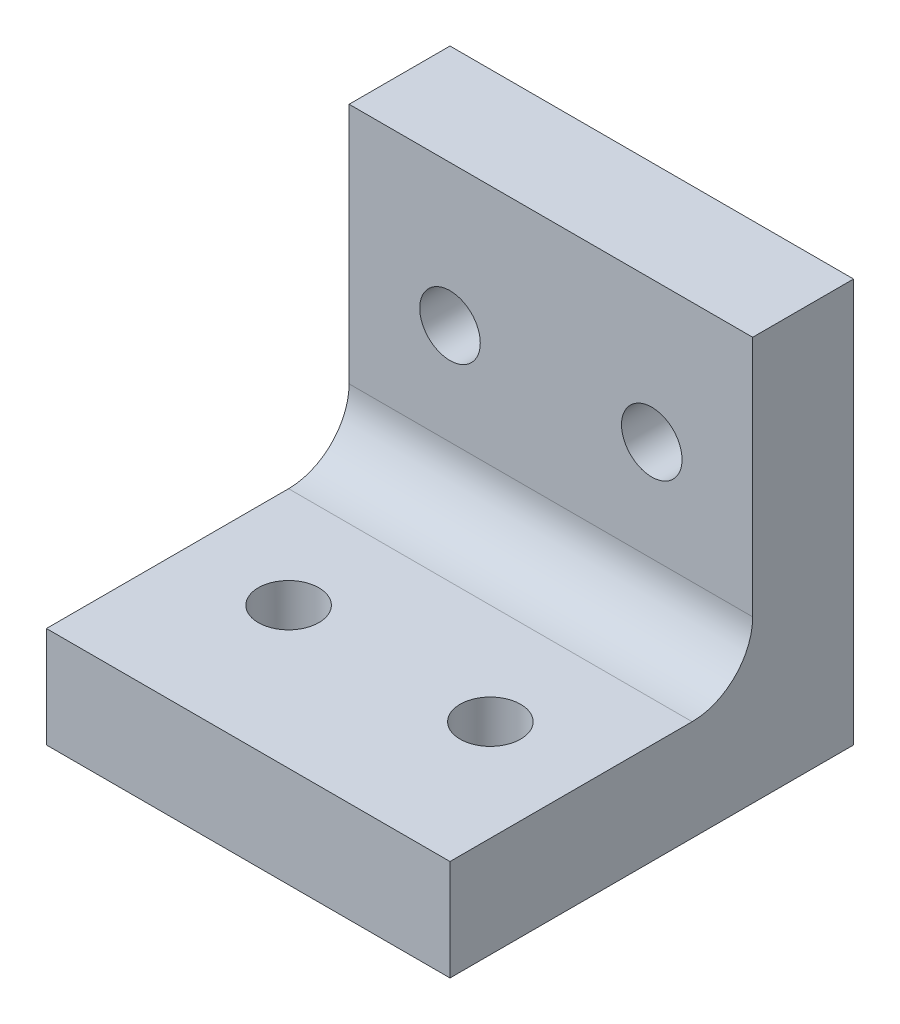
ISO-10303-21;
HEADER;
FILE_DESCRIPTION(('STEP AP214'),'2;1');
FILE_NAME('part.step','',(''),(''),'','','');
FILE_SCHEMA(('AUTOMOTIVE_DESIGN { 1 0 10303 214 1 1 1 1 }'));
ENDSEC;
DATA;
#1=APPLICATION_CONTEXT('core data for automotive mechanical design processes');
#2=APPLICATION_PROTOCOL_DEFINITION('international standard','automotive_design',2000,#1);
#3=PRODUCT_CONTEXT('',#1,'mechanical');
#4=PRODUCT('Part','Part','',(#3));
#5=PRODUCT_RELATED_PRODUCT_CATEGORY('part','',(#4));
#6=PRODUCT_DEFINITION_FORMATION('','',#4);
#7=PRODUCT_DEFINITION_CONTEXT('part definition',#1,'design');
#8=PRODUCT_DEFINITION('design','',#6,#7);
#9=PRODUCT_DEFINITION_SHAPE('','',#8);
#10=(LENGTH_UNIT() NAMED_UNIT(*) SI_UNIT(.MILLI.,.METRE.));
#11=(NAMED_UNIT(*) PLANE_ANGLE_UNIT() SI_UNIT($,.RADIAN.));
#12=(NAMED_UNIT(*) SI_UNIT($,.STERADIAN.) SOLID_ANGLE_UNIT());
#13=UNCERTAINTY_MEASURE_WITH_UNIT(LENGTH_MEASURE(1.E-05),#10,'distance_accuracy_value','');
#14=(GEOMETRIC_REPRESENTATION_CONTEXT(3) GLOBAL_UNCERTAINTY_ASSIGNED_CONTEXT((#13)) GLOBAL_UNIT_ASSIGNED_CONTEXT((#10,
#11,#12)) REPRESENTATION_CONTEXT('',''));
#15=CARTESIAN_POINT('',(0.,0.,0.));
#16=DIRECTION('',(0.,0.,1.));
#17=DIRECTION('',(1.,0.,0.));
#18=AXIS2_PLACEMENT_3D('',#15,#16,#17);
#19=CARTESIAN_POINT('',(0.,5.,0.));
#20=DIRECTION('',(0.,-1.,0.));
#21=DIRECTION('',(0.,0.,-1.));
#22=AXIS2_PLACEMENT_3D('',#19,#20,#21);
#23=PLANE('',#22);
#24=DIRECTION('',(0.,0.,-1.));
#25=VECTOR('',#24,1.);
#26=CARTESIAN_POINT('',(10.,5.,10.));
#27=LINE('',#26,#25);
#28=CARTESIAN_POINT('',(10.,5.,10.));
#29=VERTEX_POINT('',#28);
#30=CARTESIAN_POINT('',(10.,5.,-2.));
#31=VERTEX_POINT('',#30);
#32=EDGE_CURVE('E129',#29,#31,#27,.T.);
#33=ORIENTED_EDGE('',*,*,#32,.T.);
#34=DIRECTION('',(1.,0.,0.));
#35=VECTOR('',#34,1.);
#36=CARTESIAN_POINT('',(-10.,5.,-2.));
#37=LINE('',#36,#35);
#38=CARTESIAN_POINT('',(-10.,5.,-2.));
#39=VERTEX_POINT('',#38);
#40=EDGE_CURVE('E59',#31,#39,#37,.F.);
#41=ORIENTED_EDGE('',*,*,#40,.T.);
#42=DIRECTION('',(0.,0.,1.));
#43=VECTOR('',#42,1.);
#44=CARTESIAN_POINT('',(-10.,5.,10.));
#45=LINE('',#44,#43);
#46=CARTESIAN_POINT('',(-10.,5.,10.));
#47=VERTEX_POINT('',#46);
#48=EDGE_CURVE('E131',#39,#47,#45,.T.);
#49=ORIENTED_EDGE('',*,*,#48,.T.);
#50=DIRECTION('',(1.,0.,0.));
#51=VECTOR('',#50,1.);
#52=CARTESIAN_POINT('',(-10.,5.,10.));
#53=LINE('',#52,#51);
#54=EDGE_CURVE('E134',#47,#29,#53,.T.);
#55=ORIENTED_EDGE('',*,*,#54,.T.);
#56=EDGE_LOOP('',(#33,#41,#49,#55));
#57=FACE_BOUND('',#56,.T.);
#58=CARTESIAN_POINT('',(5.,5.,3.));
#59=DIRECTION('',(0.,-1.,0.));
#60=DIRECTION('',(0.,0.,-1.));
#61=AXIS2_PLACEMENT_3D('',#58,#59,#60);
#62=CIRCLE('',#61,1.5);
#63=CARTESIAN_POINT('',(5.,5.,1.5));
#64=VERTEX_POINT('',#63);
#65=EDGE_CURVE('E307',#64,#64,#62,.F.);
#66=ORIENTED_EDGE('',*,*,#65,.F.);
#67=EDGE_LOOP('',(#66));
#68=FACE_BOUND('',#67,.T.);
#69=CARTESIAN_POINT('',(-5.,5.,3.));
#70=DIRECTION('',(0.,-1.,0.));
#71=DIRECTION('',(0.,0.,-1.));
#72=AXIS2_PLACEMENT_3D('',#69,#70,#71);
#73=CIRCLE('',#72,1.5);
#74=CARTESIAN_POINT('',(-5.,5.,1.5));
#75=VERTEX_POINT('',#74);
#76=EDGE_CURVE('E115',#75,#75,#73,.T.);
#77=ORIENTED_EDGE('',*,*,#76,.T.);
#78=EDGE_LOOP('',(#77));
#79=FACE_BOUND('',#78,.T.);
#80=ADVANCED_FACE('F38',(#57,#68,#79),#23,.F.);
#81=CARTESIAN_POINT('',(0.,0.,0.));
#82=DIRECTION('',(0.,-1.,0.));
#83=DIRECTION('',(0.,0.,-1.));
#84=AXIS2_PLACEMENT_3D('',#81,#82,#83);
#85=PLANE('',#84);
#86=CARTESIAN_POINT('',(5.,0.,3.));
#87=DIRECTION('',(0.,-1.,0.));
#88=DIRECTION('',(0.,0.,-1.));
#89=AXIS2_PLACEMENT_3D('',#86,#87,#88);
#90=CIRCLE('',#89,1.5);
#91=CARTESIAN_POINT('',(5.,0.,1.5));
#92=VERTEX_POINT('',#91);
#93=EDGE_CURVE('E308',#92,#92,#90,.T.);
#94=ORIENTED_EDGE('',*,*,#93,.F.);
#95=EDGE_LOOP('',(#94));
#96=FACE_BOUND('',#95,.T.);
#97=DIRECTION('',(0.,0.,-1.));
#98=VECTOR('',#97,1.);
#99=CARTESIAN_POINT('',(10.,0.,10.));
#100=LINE('',#99,#98);
#101=CARTESIAN_POINT('',(10.,0.,10.));
#102=VERTEX_POINT('',#101);
#103=CARTESIAN_POINT('',(10.,0.,-10.));
#104=VERTEX_POINT('',#103);
#105=EDGE_CURVE('E121',#102,#104,#100,.T.);
#106=ORIENTED_EDGE('',*,*,#105,.F.);
#107=DIRECTION('',(1.,0.,0.));
#108=VECTOR('',#107,1.);
#109=CARTESIAN_POINT('',(-10.,0.,10.));
#110=LINE('',#109,#108);
#111=CARTESIAN_POINT('',(-10.,0.,10.));
#112=VERTEX_POINT('',#111);
#113=EDGE_CURVE('E132',#112,#102,#110,.T.);
#114=ORIENTED_EDGE('',*,*,#113,.F.);
#115=DIRECTION('',(0.,0.,1.));
#116=VECTOR('',#115,1.);
#117=CARTESIAN_POINT('',(-10.,0.,10.));
#118=LINE('',#117,#116);
#119=CARTESIAN_POINT('',(-10.,0.,-10.));
#120=VERTEX_POINT('',#119);
#121=EDGE_CURVE('E138',#120,#112,#118,.T.);
#122=ORIENTED_EDGE('',*,*,#121,.F.);
#123=DIRECTION('',(-1.,0.,0.));
#124=VECTOR('',#123,1.);
#125=CARTESIAN_POINT('',(-10.,0.,-10.));
#126=LINE('',#125,#124);
#127=EDGE_CURVE('E124',#104,#120,#126,.T.);
#128=ORIENTED_EDGE('',*,*,#127,.F.);
#129=EDGE_LOOP('',(#106,#114,#122,#128));
#130=FACE_BOUND('',#129,.T.);
#131=CARTESIAN_POINT('',(-5.,0.,3.));
#132=DIRECTION('',(0.,1.,0.));
#133=DIRECTION('',(0.,0.,1.));
#134=AXIS2_PLACEMENT_3D('',#131,#132,#133);
#135=CIRCLE('',#134,1.5);
#136=CARTESIAN_POINT('',(-5.,0.,4.5));
#137=VERTEX_POINT('',#136);
#138=EDGE_CURVE('E304',#137,#137,#135,.T.);
#139=ORIENTED_EDGE('',*,*,#138,.T.);
#140=EDGE_LOOP('',(#139));
#141=FACE_BOUND('',#140,.T.);
#142=ADVANCED_FACE('F157',(#96,#130,#141),#85,.T.);
#143=CARTESIAN_POINT('',(10.,5.,10.));
#144=DIRECTION('',(-1.,0.,0.));
#145=DIRECTION('',(0.,0.,1.));
#146=AXIS2_PLACEMENT_3D('',#143,#144,#145);
#147=PLANE('',#146);
#148=ORIENTED_EDGE('',*,*,#105,.T.);
#149=DIRECTION('',(0.,-1.,0.));
#150=VECTOR('',#149,1.);
#151=CARTESIAN_POINT('',(10.,5.,-10.));
#152=LINE('',#151,#150);
#153=CARTESIAN_POINT('',(10.,20.,-10.));
#154=VERTEX_POINT('',#153);
#155=EDGE_CURVE('E101',#154,#104,#152,.T.);
#156=ORIENTED_EDGE('',*,*,#155,.F.);
#157=DIRECTION('',(0.,0.,-1.));
#158=VECTOR('',#157,1.);
#159=CARTESIAN_POINT('',(10.,20.,-10.));
#160=LINE('',#159,#158);
#161=CARTESIAN_POINT('',(10.,20.,-5.));
#162=VERTEX_POINT('',#161);
#163=EDGE_CURVE('E94',#162,#154,#160,.T.);
#164=ORIENTED_EDGE('',*,*,#163,.F.);
#165=DIRECTION('',(0.,-1.,0.));
#166=VECTOR('',#165,1.);
#167=CARTESIAN_POINT('',(10.,20.,-5.));
#168=LINE('',#167,#166);
#169=CARTESIAN_POINT('',(10.,8.,-5.));
#170=VERTEX_POINT('',#169);
#171=EDGE_CURVE('E99',#162,#170,#168,.T.);
#172=ORIENTED_EDGE('',*,*,#171,.T.);
#173=CARTESIAN_POINT('',(10.,8.,-2.));
#174=DIRECTION('',(-1.,0.,0.));
#175=DIRECTION('',(0.,0.,1.));
#176=AXIS2_PLACEMENT_3D('',#173,#174,#175);
#177=CIRCLE('',#176,3.);
#178=EDGE_CURVE('E46',#170,#31,#177,.T.);
#179=ORIENTED_EDGE('',*,*,#178,.T.);
#180=ORIENTED_EDGE('',*,*,#32,.F.);
#181=DIRECTION('',(0.,-1.,0.));
#182=VECTOR('',#181,1.);
#183=CARTESIAN_POINT('',(10.,5.,10.));
#184=LINE('',#183,#182);
#185=EDGE_CURVE('E135',#29,#102,#184,.T.);
#186=ORIENTED_EDGE('',*,*,#185,.T.);
#187=EDGE_LOOP('',(#148,#156,#164,#172,#179,#180,#186));
#188=FACE_BOUND('',#187,.T.);
#189=ADVANCED_FACE('F97',(#188),#147,.F.);
#190=CARTESIAN_POINT('',(-10.,5.,-10.));
#191=DIRECTION('',(0.,0.,1.));
#192=DIRECTION('',(1.,0.,0.));
#193=AXIS2_PLACEMENT_3D('',#190,#191,#192);
#194=PLANE('',#193);
#195=CARTESIAN_POINT('',(-5.,13.,-10.));
#196=DIRECTION('',(0.,0.,1.));
#197=DIRECTION('',(1.,0.,0.));
#198=AXIS2_PLACEMENT_3D('',#195,#196,#197);
#199=CIRCLE('',#198,1.5);
#200=CARTESIAN_POINT('',(-3.5,13.,-10.));
#201=VERTEX_POINT('',#200);
#202=EDGE_CURVE('E311',#201,#201,#199,.T.);
#203=ORIENTED_EDGE('',*,*,#202,.T.);
#204=EDGE_LOOP('',(#203));
#205=FACE_BOUND('',#204,.T.);
#206=CARTESIAN_POINT('',(5.,13.,-10.));
#207=DIRECTION('',(0.,0.,1.));
#208=DIRECTION('',(-1.,0.,0.));
#209=AXIS2_PLACEMENT_3D('',#206,#207,#208);
#210=CIRCLE('',#209,1.5);
#211=CARTESIAN_POINT('',(3.5,13.,-10.));
#212=VERTEX_POINT('',#211);
#213=EDGE_CURVE('E294',#212,#212,#210,.T.);
#214=ORIENTED_EDGE('',*,*,#213,.T.);
#215=EDGE_LOOP('',(#214));
#216=FACE_BOUND('',#215,.T.);
#217=ORIENTED_EDGE('',*,*,#127,.T.);
#218=DIRECTION('',(0.,-1.,0.));
#219=VECTOR('',#218,1.);
#220=CARTESIAN_POINT('',(-10.,5.,-10.));
#221=LINE('',#220,#219);
#222=CARTESIAN_POINT('',(-10.,20.,-10.));
#223=VERTEX_POINT('',#222);
#224=EDGE_CURVE('E146',#223,#120,#221,.T.);
#225=ORIENTED_EDGE('',*,*,#224,.F.);
#226=DIRECTION('',(-1.,0.,0.));
#227=VECTOR('',#226,1.);
#228=CARTESIAN_POINT('',(-10.,20.,-10.));
#229=LINE('',#228,#227);
#230=EDGE_CURVE('E105',#154,#223,#229,.T.);
#231=ORIENTED_EDGE('',*,*,#230,.F.);
#232=ORIENTED_EDGE('',*,*,#155,.T.);
#233=EDGE_LOOP('',(#217,#225,#231,#232));
#234=FACE_BOUND('',#233,.T.);
#235=ADVANCED_FACE('F152',(#205,#216,#234),#194,.F.);
#236=CARTESIAN_POINT('',(-10.,5.,10.));
#237=DIRECTION('',(1.,0.,0.));
#238=DIRECTION('',(0.,0.,-1.));
#239=AXIS2_PLACEMENT_3D('',#236,#237,#238);
#240=PLANE('',#239);
#241=ORIENTED_EDGE('',*,*,#121,.T.);
#242=DIRECTION('',(0.,-1.,0.));
#243=VECTOR('',#242,1.);
#244=CARTESIAN_POINT('',(-10.,5.,10.));
#245=LINE('',#244,#243);
#246=EDGE_CURVE('E143',#47,#112,#245,.T.);
#247=ORIENTED_EDGE('',*,*,#246,.F.);
#248=ORIENTED_EDGE('',*,*,#48,.F.);
#249=CARTESIAN_POINT('',(-10.,8.,-2.));
#250=DIRECTION('',(1.,0.,0.));
#251=DIRECTION('',(0.,0.,-1.));
#252=AXIS2_PLACEMENT_3D('',#249,#250,#251);
#253=CIRCLE('',#252,3.);
#254=CARTESIAN_POINT('',(-10.,8.,-5.));
#255=VERTEX_POINT('',#254);
#256=EDGE_CURVE('E11',#39,#255,#253,.T.);
#257=ORIENTED_EDGE('',*,*,#256,.T.);
#258=DIRECTION('',(0.,-1.,0.));
#259=VECTOR('',#258,1.);
#260=CARTESIAN_POINT('',(-10.,20.,-5.));
#261=LINE('',#260,#259);
#262=CARTESIAN_POINT('',(-10.,20.,-5.));
#263=VERTEX_POINT('',#262);
#264=EDGE_CURVE('E122',#263,#255,#261,.T.);
#265=ORIENTED_EDGE('',*,*,#264,.F.);
#266=DIRECTION('',(0.,0.,1.));
#267=VECTOR('',#266,1.);
#268=CARTESIAN_POINT('',(-10.,20.,-10.));
#269=LINE('',#268,#267);
#270=EDGE_CURVE('E111',#223,#263,#269,.T.);
#271=ORIENTED_EDGE('',*,*,#270,.F.);
#272=ORIENTED_EDGE('',*,*,#224,.T.);
#273=EDGE_LOOP('',(#241,#247,#248,#257,#265,#271,#272));
#274=FACE_BOUND('',#273,.T.);
#275=ADVANCED_FACE('F162',(#274),#240,.F.);
#276=CARTESIAN_POINT('',(-10.,5.,10.));
#277=DIRECTION('',(0.,0.,-1.));
#278=DIRECTION('',(-1.,0.,0.));
#279=AXIS2_PLACEMENT_3D('',#276,#277,#278);
#280=PLANE('',#279);
#281=ORIENTED_EDGE('',*,*,#113,.T.);
#282=ORIENTED_EDGE('',*,*,#185,.F.);
#283=ORIENTED_EDGE('',*,*,#54,.F.);
#284=ORIENTED_EDGE('',*,*,#246,.T.);
#285=EDGE_LOOP('',(#281,#282,#283,#284));
#286=FACE_BOUND('',#285,.T.);
#287=ADVANCED_FACE('F165',(#286),#280,.F.);
#288=CARTESIAN_POINT('',(-10.,20.,-5.));
#289=DIRECTION('',(0.,0.,-1.));
#290=DIRECTION('',(-1.,0.,0.));
#291=AXIS2_PLACEMENT_3D('',#288,#289,#290);
#292=PLANE('',#291);
#293=CARTESIAN_POINT('',(-5.,13.,-5.));
#294=DIRECTION('',(0.,0.,1.));
#295=DIRECTION('',(1.,0.,0.));
#296=AXIS2_PLACEMENT_3D('',#293,#294,#295);
#297=CIRCLE('',#296,1.5);
#298=CARTESIAN_POINT('',(-3.5,13.,-5.));
#299=VERTEX_POINT('',#298);
#300=EDGE_CURVE('E300',#299,#299,#297,.T.);
#301=ORIENTED_EDGE('',*,*,#300,.F.);
#302=EDGE_LOOP('',(#301));
#303=FACE_BOUND('',#302,.T.);
#304=CARTESIAN_POINT('',(5.,13.,-5.));
#305=DIRECTION('',(0.,0.,1.));
#306=DIRECTION('',(-1.,0.,0.));
#307=AXIS2_PLACEMENT_3D('',#304,#305,#306);
#308=CIRCLE('',#307,1.5);
#309=CARTESIAN_POINT('',(3.5,13.,-5.));
#310=VERTEX_POINT('',#309);
#311=EDGE_CURVE('E297',#310,#310,#308,.T.);
#312=ORIENTED_EDGE('',*,*,#311,.F.);
#313=EDGE_LOOP('',(#312));
#314=FACE_BOUND('',#313,.T.);
#315=ORIENTED_EDGE('',*,*,#264,.T.);
#316=DIRECTION('',(1.,0.,0.));
#317=VECTOR('',#316,1.);
#318=CARTESIAN_POINT('',(10.,8.,-5.));
#319=LINE('',#318,#317);
#320=EDGE_CURVE('E120',#255,#170,#319,.T.);
#321=ORIENTED_EDGE('',*,*,#320,.T.);
#322=ORIENTED_EDGE('',*,*,#171,.F.);
#323=DIRECTION('',(1.,0.,0.));
#324=VECTOR('',#323,1.);
#325=CARTESIAN_POINT('',(-10.,20.,-5.));
#326=LINE('',#325,#324);
#327=EDGE_CURVE('E106',#263,#162,#326,.T.);
#328=ORIENTED_EDGE('',*,*,#327,.F.);
#329=EDGE_LOOP('',(#315,#321,#322,#328));
#330=FACE_BOUND('',#329,.T.);
#331=ADVANCED_FACE('F118',(#303,#314,#330),#292,.F.);
#332=CARTESIAN_POINT('',(0.,20.,0.));
#333=DIRECTION('',(0.,-1.,0.));
#334=DIRECTION('',(0.,0.,-1.));
#335=AXIS2_PLACEMENT_3D('',#332,#333,#334);
#336=PLANE('',#335);
#337=ORIENTED_EDGE('',*,*,#327,.T.);
#338=ORIENTED_EDGE('',*,*,#163,.T.);
#339=ORIENTED_EDGE('',*,*,#230,.T.);
#340=ORIENTED_EDGE('',*,*,#270,.T.);
#341=EDGE_LOOP('',(#337,#338,#339,#340));
#342=FACE_BOUND('',#341,.T.);
#343=ADVANCED_FACE('F109',(#342),#336,.F.);
#344=CARTESIAN_POINT('',(5.,0.,3.));
#345=DIRECTION('',(0.,1.,0.));
#346=DIRECTION('',(0.,0.,1.));
#347=AXIS2_PLACEMENT_3D('',#344,#345,#346);
#348=CYLINDRICAL_SURFACE('',#347,1.5);
#349=ORIENTED_EDGE('',*,*,#93,.T.);
#350=EDGE_LOOP('',(#349));
#351=FACE_BOUND('',#350,.T.);
#352=ORIENTED_EDGE('',*,*,#65,.T.);
#353=EDGE_LOOP('',(#352));
#354=FACE_BOUND('',#353,.T.);
#355=ADVANCED_FACE('F224',(#351,#354),#348,.F.);
#356=CARTESIAN_POINT('',(-5.,0.,3.));
#357=DIRECTION('',(0.,1.,0.));
#358=DIRECTION('',(0.,0.,1.));
#359=AXIS2_PLACEMENT_3D('',#356,#357,#358);
#360=CYLINDRICAL_SURFACE('',#359,1.5);
#361=ORIENTED_EDGE('',*,*,#138,.F.);
#362=EDGE_LOOP('',(#361));
#363=FACE_BOUND('',#362,.T.);
#364=ORIENTED_EDGE('',*,*,#76,.F.);
#365=EDGE_LOOP('',(#364));
#366=FACE_BOUND('',#365,.T.);
#367=ADVANCED_FACE('F230',(#363,#366),#360,.F.);
#368=CARTESIAN_POINT('',(5.,13.,-10.));
#369=DIRECTION('',(0.,0.,1.));
#370=DIRECTION('',(1.,0.,0.));
#371=AXIS2_PLACEMENT_3D('',#368,#369,#370);
#372=CYLINDRICAL_SURFACE('',#371,1.5);
#373=ORIENTED_EDGE('',*,*,#213,.F.);
#374=EDGE_LOOP('',(#373));
#375=FACE_BOUND('',#374,.T.);
#376=ORIENTED_EDGE('',*,*,#311,.T.);
#377=EDGE_LOOP('',(#376));
#378=FACE_BOUND('',#377,.T.);
#379=ADVANCED_FACE('F174',(#375,#378),#372,.F.);
#380=CARTESIAN_POINT('',(-5.,13.,-10.));
#381=DIRECTION('',(0.,0.,1.));
#382=DIRECTION('',(1.,0.,0.));
#383=AXIS2_PLACEMENT_3D('',#380,#381,#382);
#384=CYLINDRICAL_SURFACE('',#383,1.5);
#385=ORIENTED_EDGE('',*,*,#202,.F.);
#386=EDGE_LOOP('',(#385));
#387=FACE_BOUND('',#386,.T.);
#388=ORIENTED_EDGE('',*,*,#300,.T.);
#389=EDGE_LOOP('',(#388));
#390=FACE_BOUND('',#389,.T.);
#391=ADVANCED_FACE('F170',(#387,#390),#384,.F.);
#392=CARTESIAN_POINT('',(-10.,8.,-2.));
#393=DIRECTION('',(-1.,0.,0.));
#394=DIRECTION('',(0.,0.,1.));
#395=AXIS2_PLACEMENT_3D('',#392,#393,#394);
#396=CYLINDRICAL_SURFACE('',#395,3.);
#397=ORIENTED_EDGE('',*,*,#256,.F.);
#398=ORIENTED_EDGE('',*,*,#40,.F.);
#399=ORIENTED_EDGE('',*,*,#178,.F.);
#400=ORIENTED_EDGE('',*,*,#320,.F.);
#401=EDGE_LOOP('',(#397,#398,#399,#400));
#402=FACE_BOUND('',#401,.T.);
#403=ADVANCED_FACE('F40',(#402),#396,.F.);
#404=CLOSED_SHELL('',(#80,#142,#189,#235,#275,#287,#331,#343,#355,#367,#379,#391,#403));
#405=MANIFOLD_SOLID_BREP('B2',#404);
#406=ADVANCED_BREP_SHAPE_REPRESENTATION('',(#18,#405),#14);
#407=SHAPE_DEFINITION_REPRESENTATION(#9,#406);
ENDSEC;
END-ISO-10303-21;
